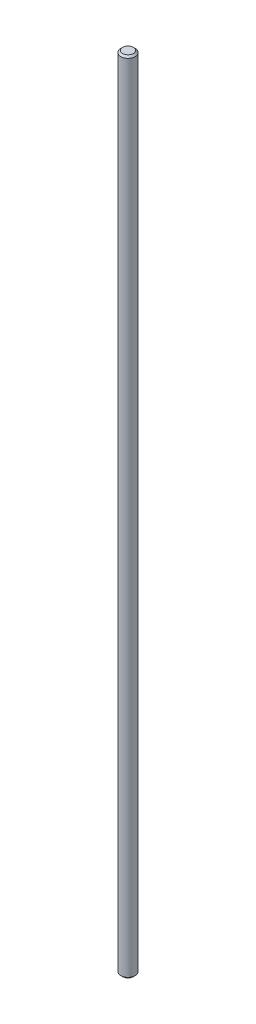
ISO-10303-21;
HEADER;
FILE_DESCRIPTION(('STEP AP214'),'2;1');
FILE_NAME('part.step','',(''),(''),'','','');
FILE_SCHEMA(('AUTOMOTIVE_DESIGN { 1 0 10303 214 1 1 1 1 }'));
ENDSEC;
DATA;
#1=APPLICATION_CONTEXT('core data for automotive mechanical design processes');
#2=APPLICATION_PROTOCOL_DEFINITION('international standard','automotive_design',2000,#1);
#3=PRODUCT_CONTEXT('',#1,'mechanical');
#4=PRODUCT('Part','Part','',(#3));
#5=PRODUCT_RELATED_PRODUCT_CATEGORY('part','',(#4));
#6=PRODUCT_DEFINITION_FORMATION('','',#4);
#7=PRODUCT_DEFINITION_CONTEXT('part definition',#1,'design');
#8=PRODUCT_DEFINITION('design','',#6,#7);
#9=PRODUCT_DEFINITION_SHAPE('','',#8);
#10=(LENGTH_UNIT() NAMED_UNIT(*) SI_UNIT(.MILLI.,.METRE.));
#11=(NAMED_UNIT(*) PLANE_ANGLE_UNIT() SI_UNIT($,.RADIAN.));
#12=(NAMED_UNIT(*) SI_UNIT($,.STERADIAN.) SOLID_ANGLE_UNIT());
#13=UNCERTAINTY_MEASURE_WITH_UNIT(LENGTH_MEASURE(1.E-05),#10,'distance_accuracy_value','');
#14=(GEOMETRIC_REPRESENTATION_CONTEXT(3) GLOBAL_UNCERTAINTY_ASSIGNED_CONTEXT((#13)) GLOBAL_UNIT_ASSIGNED_CONTEXT((#10,
#11,#12)) REPRESENTATION_CONTEXT('',''));
#15=CARTESIAN_POINT('',(0.,0.,0.));
#16=DIRECTION('',(0.,0.,1.));
#17=DIRECTION('',(1.,0.,0.));
#18=AXIS2_PLACEMENT_3D('',#15,#16,#17);
#19=CARTESIAN_POINT('',(0.,-220.,0.));
#20=DIRECTION('',(0.,1.,0.));
#21=DIRECTION('',(0.,0.,1.));
#22=AXIS2_PLACEMENT_3D('',#19,#20,#21);
#23=CYLINDRICAL_SURFACE('',#22,4.);
#24=CARTESIAN_POINT('',(0.,-219.,0.));
#25=DIRECTION('',(0.,1.,0.));
#26=DIRECTION('',(0.,0.,1.));
#27=AXIS2_PLACEMENT_3D('',#24,#25,#26);
#28=CIRCLE('',#27,4.);
#29=CARTESIAN_POINT('',(0.,-219.,4.));
#30=VERTEX_POINT('',#29);
#31=EDGE_CURVE('E44',#30,#30,#28,.T.);
#32=ORIENTED_EDGE('',*,*,#31,.T.);
#33=EDGE_LOOP('',(#32));
#34=FACE_BOUND('',#33,.T.);
#35=CARTESIAN_POINT('',(0.,224.,0.));
#36=DIRECTION('',(0.,1.,0.));
#37=DIRECTION('',(0.,0.,1.));
#38=AXIS2_PLACEMENT_3D('',#35,#36,#37);
#39=CIRCLE('',#38,4.);
#40=CARTESIAN_POINT('',(0.,224.,4.));
#41=VERTEX_POINT('',#40);
#42=EDGE_CURVE('E48',#41,#41,#39,.F.);
#43=ORIENTED_EDGE('',*,*,#42,.T.);
#44=EDGE_LOOP('',(#43));
#45=FACE_BOUND('',#44,.T.);
#46=ADVANCED_FACE('F33',(#34,#45),#23,.T.);
#47=CARTESIAN_POINT('',(0.,-220.,0.));
#48=DIRECTION('',(0.,1.,0.));
#49=DIRECTION('',(0.,0.,1.));
#50=AXIS2_PLACEMENT_3D('',#47,#48,#49);
#51=PLANE('',#50);
#52=CARTESIAN_POINT('',(0.,-220.,0.));
#53=DIRECTION('',(0.,1.,0.));
#54=DIRECTION('',(0.,0.,1.));
#55=AXIS2_PLACEMENT_3D('',#52,#53,#54);
#56=CIRCLE('',#55,3.00000000000011);
#57=CARTESIAN_POINT('',(0.,-220.,3.00000000000011));
#58=VERTEX_POINT('',#57);
#59=EDGE_CURVE('E40',#58,#58,#56,.F.);
#60=ORIENTED_EDGE('',*,*,#59,.T.);
#61=EDGE_LOOP('',(#60));
#62=FACE_BOUND('',#61,.T.);
#63=ADVANCED_FACE('F64',(#62),#51,.F.);
#64=CARTESIAN_POINT('',(0.,225.,0.));
#65=DIRECTION('',(0.,1.,0.));
#66=DIRECTION('',(0.,0.,1.));
#67=AXIS2_PLACEMENT_3D('',#64,#65,#66);
#68=PLANE('',#67);
#69=CARTESIAN_POINT('',(0.,225.,0.));
#70=DIRECTION('',(0.,1.,0.));
#71=DIRECTION('',(0.,0.,1.));
#72=AXIS2_PLACEMENT_3D('',#69,#70,#71);
#73=CIRCLE('',#72,2.99999999999995);
#74=CARTESIAN_POINT('',(0.,225.,2.99999999999995));
#75=VERTEX_POINT('',#74);
#76=EDGE_CURVE('E10',#75,#75,#73,.T.);
#77=ORIENTED_EDGE('',*,*,#76,.T.);
#78=EDGE_LOOP('',(#77));
#79=FACE_BOUND('',#78,.T.);
#80=ADVANCED_FACE('F61',(#79),#68,.T.);
#81=CARTESIAN_POINT('',(0.,-219.,0.));
#82=DIRECTION('',(0.,1.,0.));
#83=DIRECTION('',(0.,0.,1.));
#84=AXIS2_PLACEMENT_3D('',#81,#82,#83);
#85=CONICAL_SURFACE('',#84,4.,0.785398163397474);
#86=ORIENTED_EDGE('',*,*,#59,.F.);
#87=EDGE_LOOP('',(#86));
#88=FACE_BOUND('',#87,.T.);
#89=ORIENTED_EDGE('',*,*,#31,.F.);
#90=EDGE_LOOP('',(#89));
#91=FACE_BOUND('',#90,.T.);
#92=ADVANCED_FACE('F57',(#88,#91),#85,.T.);
#93=CARTESIAN_POINT('',(0.,225.,0.));
#94=DIRECTION('',(0.,-1.,0.));
#95=DIRECTION('',(0.,0.,-1.));
#96=AXIS2_PLACEMENT_3D('',#93,#94,#95);
#97=CONICAL_SURFACE('',#96,2.99999999999995,0.785398163397474);
#98=ORIENTED_EDGE('',*,*,#42,.F.);
#99=EDGE_LOOP('',(#98));
#100=FACE_BOUND('',#99,.T.);
#101=ORIENTED_EDGE('',*,*,#76,.F.);
#102=EDGE_LOOP('',(#101));
#103=FACE_BOUND('',#102,.T.);
#104=ADVANCED_FACE('F35',(#100,#103),#97,.T.);
#105=CLOSED_SHELL('',(#46,#63,#80,#92,#104));
#106=MANIFOLD_SOLID_BREP('B2',#105);
#107=ADVANCED_BREP_SHAPE_REPRESENTATION('',(#18,#106),#14);
#108=SHAPE_DEFINITION_REPRESENTATION(#9,#107);
ENDSEC;
END-ISO-10303-21;
